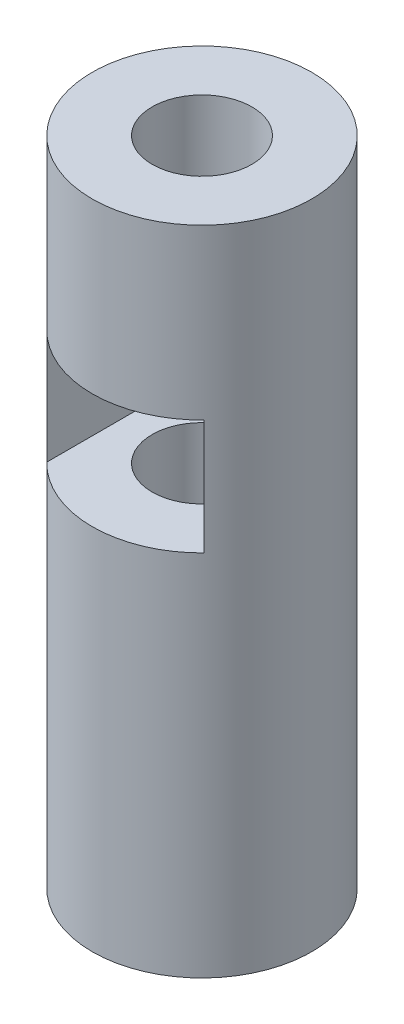
ISO-10303-21;
HEADER;
FILE_DESCRIPTION(('STEP AP214'),'2;1');
FILE_NAME('part.step','',(''),(''),'','','');
FILE_SCHEMA(('AUTOMOTIVE_DESIGN { 1 0 10303 214 1 1 1 1 }'));
ENDSEC;
DATA;
#1=APPLICATION_CONTEXT('core data for automotive mechanical design processes');
#2=APPLICATION_PROTOCOL_DEFINITION('international standard','automotive_design',2000,#1);
#3=PRODUCT_CONTEXT('',#1,'mechanical');
#4=PRODUCT('Part','Part','',(#3));
#5=PRODUCT_RELATED_PRODUCT_CATEGORY('part','',(#4));
#6=PRODUCT_DEFINITION_FORMATION('','',#4);
#7=PRODUCT_DEFINITION_CONTEXT('part definition',#1,'design');
#8=PRODUCT_DEFINITION('design','',#6,#7);
#9=PRODUCT_DEFINITION_SHAPE('','',#8);
#10=(LENGTH_UNIT() NAMED_UNIT(*) SI_UNIT(.MILLI.,.METRE.));
#11=(NAMED_UNIT(*) PLANE_ANGLE_UNIT() SI_UNIT($,.RADIAN.));
#12=(NAMED_UNIT(*) SI_UNIT($,.STERADIAN.) SOLID_ANGLE_UNIT());
#13=UNCERTAINTY_MEASURE_WITH_UNIT(LENGTH_MEASURE(1.E-05),#10,'distance_accuracy_value','');
#14=(GEOMETRIC_REPRESENTATION_CONTEXT(3) GLOBAL_UNCERTAINTY_ASSIGNED_CONTEXT((#13)) GLOBAL_UNIT_ASSIGNED_CONTEXT((#10,
#11,#12)) REPRESENTATION_CONTEXT('',''));
#15=CARTESIAN_POINT('',(0.,0.,0.));
#16=DIRECTION('',(0.,0.,1.));
#17=DIRECTION('',(1.,0.,0.));
#18=AXIS2_PLACEMENT_3D('',#15,#16,#17);
#19=CARTESIAN_POINT('',(0.,40.,0.));
#20=DIRECTION('',(0.,-1.,0.));
#21=DIRECTION('',(0.,0.,-1.));
#22=AXIS2_PLACEMENT_3D('',#19,#20,#21);
#23=CYLINDRICAL_SURFACE('',#22,2.6);
#24=CARTESIAN_POINT('',(0.,7.2,0.));
#25=DIRECTION('',(0.,1.,0.));
#26=DIRECTION('',(0.,0.,1.));
#27=AXIS2_PLACEMENT_3D('',#24,#25,#26);
#28=CIRCLE('',#27,2.6);
#29=CARTESIAN_POINT('',(0.,7.2,2.6));
#30=VERTEX_POINT('',#29);
#31=EDGE_CURVE('E190',#30,#30,#28,.F.);
#32=ORIENTED_EDGE('',*,*,#31,.T.);
#33=EDGE_LOOP('',(#32));
#34=FACE_BOUND('',#33,.T.);
#35=CARTESIAN_POINT('',(0.,19.2,0.));
#36=DIRECTION('',(0.,1.,0.));
#37=DIRECTION('',(0.,0.,1.));
#38=AXIS2_PLACEMENT_3D('',#35,#36,#37);
#39=CIRCLE('',#38,2.6);
#40=CARTESIAN_POINT('',(0.,19.2,2.6));
#41=VERTEX_POINT('',#40);
#42=EDGE_CURVE('E121',#41,#41,#39,.F.);
#43=ORIENTED_EDGE('',*,*,#42,.F.);
#44=EDGE_LOOP('',(#43));
#45=FACE_BOUND('',#44,.T.);
#46=ADVANCED_FACE('F33',(#34,#45),#23,.F.);
#47=CARTESIAN_POINT('',(0.,0.,0.));
#48=DIRECTION('',(0.,-1.,0.));
#49=DIRECTION('',(0.,0.,-1.));
#50=AXIS2_PLACEMENT_3D('',#47,#48,#49);
#51=CIRCLE('',#50,2.6);
#52=CARTESIAN_POINT('',(0.,0.,-2.6));
#53=VERTEX_POINT('',#52);
#54=EDGE_CURVE('E194',#53,#53,#51,.T.);
#55=ORIENTED_EDGE('',*,*,#54,.T.);
#56=EDGE_LOOP('',(#55));
#57=FACE_BOUND('',#56,.T.);
#58=CARTESIAN_POINT('',(0.,2.5,0.));
#59=DIRECTION('',(0.,1.,0.));
#60=DIRECTION('',(0.,0.,1.));
#61=AXIS2_PLACEMENT_3D('',#58,#59,#60);
#62=CIRCLE('',#61,2.6);
#63=CARTESIAN_POINT('',(0.,2.5,2.6));
#64=VERTEX_POINT('',#63);
#65=EDGE_CURVE('E198',#64,#64,#62,.F.);
#66=ORIENTED_EDGE('',*,*,#65,.F.);
#67=EDGE_LOOP('',(#66));
#68=FACE_BOUND('',#67,.T.);
#69=ADVANCED_FACE('F237',(#57,#68),#23,.F.);
#70=CARTESIAN_POINT('',(0.,34.,0.));
#71=DIRECTION('',(0.,1.,0.));
#72=DIRECTION('',(0.,0.,1.));
#73=AXIS2_PLACEMENT_3D('',#70,#71,#72);
#74=PLANE('',#73);
#75=CARTESIAN_POINT('',(0.,34.,0.));
#76=DIRECTION('',(0.,1.,0.));
#77=DIRECTION('',(0.,0.,1.));
#78=AXIS2_PLACEMENT_3D('',#75,#76,#77);
#79=CIRCLE('',#78,2.6);
#80=CARTESIAN_POINT('',(0.,34.,2.6));
#81=VERTEX_POINT('',#80);
#82=EDGE_CURVE('E197',#81,#81,#79,.T.);
#83=ORIENTED_EDGE('',*,*,#82,.F.);
#84=EDGE_LOOP('',(#83));
#85=FACE_BOUND('',#84,.T.);
#86=CARTESIAN_POINT('',(0.,34.,0.));
#87=DIRECTION('',(0.,1.,0.));
#88=DIRECTION('',(0.,0.,1.));
#89=AXIS2_PLACEMENT_3D('',#86,#87,#88);
#90=CIRCLE('',#89,5.725);
#91=CARTESIAN_POINT('',(0.,34.,5.725));
#92=VERTEX_POINT('',#91);
#93=EDGE_CURVE('E202',#92,#92,#90,.T.);
#94=ORIENTED_EDGE('',*,*,#93,.T.);
#95=EDGE_LOOP('',(#94));
#96=FACE_BOUND('',#95,.T.);
#97=ADVANCED_FACE('F244',(#85,#96),#74,.T.);
#98=CARTESIAN_POINT('',(0.,0.,0.));
#99=DIRECTION('',(0.,1.,0.));
#100=DIRECTION('',(0.,0.,1.));
#101=AXIS2_PLACEMENT_3D('',#98,#99,#100);
#102=PLANE('',#101);
#103=ORIENTED_EDGE('',*,*,#54,.F.);
#104=EDGE_LOOP('',(#103));
#105=FACE_BOUND('',#104,.T.);
#106=CARTESIAN_POINT('',(0.,0.,0.));
#107=DIRECTION('',(0.,1.,0.));
#108=DIRECTION('',(0.,0.,1.));
#109=AXIS2_PLACEMENT_3D('',#106,#107,#108);
#110=CIRCLE('',#109,5.725);
#111=CARTESIAN_POINT('',(0.,0.,5.725));
#112=VERTEX_POINT('',#111);
#113=EDGE_CURVE('E201',#112,#112,#110,.T.);
#114=ORIENTED_EDGE('',*,*,#113,.F.);
#115=EDGE_LOOP('',(#114));
#116=FACE_BOUND('',#115,.T.);
#117=ADVANCED_FACE('F259',(#105,#116),#102,.F.);
#118=CARTESIAN_POINT('',(0.,34.,0.));
#119=DIRECTION('',(0.,-1.,0.));
#120=DIRECTION('',(0.,0.,-1.));
#121=AXIS2_PLACEMENT_3D('',#118,#119,#120);
#122=CYLINDRICAL_SURFACE('',#121,5.725);
#123=DIRECTION('',(0.,-1.,0.));
#124=VECTOR('',#123,1.);
#125=CARTESIAN_POINT('',(-4.1,34.,3.99570081462564));
#126=LINE('',#125,#124);
#127=CARTESIAN_POINT('',(-4.1,25.2,3.99570081462564));
#128=VERTEX_POINT('',#127);
#129=CARTESIAN_POINT('',(-4.1,19.2,3.99570081462564));
#130=VERTEX_POINT('',#129);
#131=EDGE_CURVE('E11',#128,#130,#126,.T.);
#132=ORIENTED_EDGE('',*,*,#131,.F.);
#133=CARTESIAN_POINT('',(0.,25.2,0.));
#134=DIRECTION('',(0.,1.,0.));
#135=DIRECTION('',(0.,0.,1.));
#136=AXIS2_PLACEMENT_3D('',#133,#134,#135);
#137=CIRCLE('',#136,5.725);
#138=CARTESIAN_POINT('',(4.1,25.2,3.99570081462564));
#139=VERTEX_POINT('',#138);
#140=EDGE_CURVE('E154',#128,#139,#137,.T.);
#141=ORIENTED_EDGE('',*,*,#140,.T.);
#142=DIRECTION('',(0.,-1.,0.));
#143=VECTOR('',#142,1.);
#144=CARTESIAN_POINT('',(4.1,34.,3.99570081462564));
#145=LINE('',#144,#143);
#146=CARTESIAN_POINT('',(4.1,19.2,3.99570081462564));
#147=VERTEX_POINT('',#146);
#148=EDGE_CURVE('E41',#139,#147,#145,.T.);
#149=ORIENTED_EDGE('',*,*,#148,.T.);
#150=CARTESIAN_POINT('',(0.,19.2,0.));
#151=DIRECTION('',(0.,1.,0.));
#152=DIRECTION('',(0.,0.,1.));
#153=AXIS2_PLACEMENT_3D('',#150,#151,#152);
#154=CIRCLE('',#153,5.725);
#155=EDGE_CURVE('E151',#130,#147,#154,.T.);
#156=ORIENTED_EDGE('',*,*,#155,.F.);
#157=EDGE_LOOP('',(#132,#141,#149,#156));
#158=FACE_BOUND('',#157,.T.);
#159=CARTESIAN_POINT('',(0.,7.2,0.));
#160=DIRECTION('',(0.,1.,0.));
#161=DIRECTION('',(-1.,0.,0.));
#162=AXIS2_PLACEMENT_3D('',#159,#160,#161);
#163=CIRCLE('',#162,5.725);
#164=CARTESIAN_POINT('',(4.1,7.2,-3.99570081462564));
#165=VERTEX_POINT('',#164);
#166=CARTESIAN_POINT('',(-4.1,7.2,-3.99570081462564));
#167=VERTEX_POINT('',#166);
#168=EDGE_CURVE('E159',#165,#167,#163,.T.);
#169=ORIENTED_EDGE('',*,*,#168,.T.);
#170=DIRECTION('',(0.,-1.,0.));
#171=VECTOR('',#170,1.);
#172=CARTESIAN_POINT('',(-4.1,34.,-3.99570081462564));
#173=LINE('',#172,#171);
#174=CARTESIAN_POINT('',(-4.1,2.5,-3.99570081462564));
#175=VERTEX_POINT('',#174);
#176=EDGE_CURVE('E165',#167,#175,#173,.T.);
#177=ORIENTED_EDGE('',*,*,#176,.T.);
#178=CARTESIAN_POINT('',(0.,2.5,0.));
#179=DIRECTION('',(0.,-1.,0.));
#180=DIRECTION('',(1.,0.,0.));
#181=AXIS2_PLACEMENT_3D('',#178,#179,#180);
#182=CIRCLE('',#181,5.725);
#183=CARTESIAN_POINT('',(4.1,2.5,-3.99570081462564));
#184=VERTEX_POINT('',#183);
#185=EDGE_CURVE('E156',#175,#184,#182,.T.);
#186=ORIENTED_EDGE('',*,*,#185,.T.);
#187=DIRECTION('',(0.,-1.,0.));
#188=VECTOR('',#187,1.);
#189=CARTESIAN_POINT('',(4.1,34.,-3.99570081462564));
#190=LINE('',#189,#188);
#191=EDGE_CURVE('E162',#184,#165,#190,.F.);
#192=ORIENTED_EDGE('',*,*,#191,.T.);
#193=EDGE_LOOP('',(#169,#177,#186,#192));
#194=FACE_BOUND('',#193,.T.);
#195=ORIENTED_EDGE('',*,*,#93,.F.);
#196=EDGE_LOOP('',(#195));
#197=FACE_BOUND('',#196,.T.);
#198=ORIENTED_EDGE('',*,*,#113,.T.);
#199=EDGE_LOOP('',(#198));
#200=FACE_BOUND('',#199,.T.);
#201=ADVANCED_FACE('F35',(#158,#194,#197,#200),#122,.T.);
#202=CARTESIAN_POINT('',(0.,25.2,0.));
#203=DIRECTION('',(0.,1.,0.));
#204=DIRECTION('',(0.,0.,1.));
#205=AXIS2_PLACEMENT_3D('',#202,#203,#204);
#206=CIRCLE('',#205,2.6);
#207=CARTESIAN_POINT('',(0.,25.2,2.6));
#208=VERTEX_POINT('',#207);
#209=EDGE_CURVE('E153',#208,#208,#206,.F.);
#210=ORIENTED_EDGE('',*,*,#209,.T.);
#211=EDGE_LOOP('',(#210));
#212=FACE_BOUND('',#211,.T.);
#213=ORIENTED_EDGE('',*,*,#82,.T.);
#214=EDGE_LOOP('',(#213));
#215=FACE_BOUND('',#214,.T.);
#216=ADVANCED_FACE('F240',(#212,#215),#23,.F.);
#217=CARTESIAN_POINT('',(0.,2.5,0.));
#218=DIRECTION('',(0.,1.,0.));
#219=DIRECTION('',(0.,0.,1.));
#220=AXIS2_PLACEMENT_3D('',#217,#218,#219);
#221=PLANE('',#220);
#222=ORIENTED_EDGE('',*,*,#65,.T.);
#223=EDGE_LOOP('',(#222));
#224=FACE_BOUND('',#223,.T.);
#225=DIRECTION('',(0.,0.,1.));
#226=VECTOR('',#225,1.);
#227=CARTESIAN_POINT('',(-4.1,2.5,-2.36713610367747));
#228=LINE('',#227,#226);
#229=CARTESIAN_POINT('',(-4.1,2.5,2.36713610367746));
#230=VERTEX_POINT('',#229);
#231=EDGE_CURVE('E176',#175,#230,#228,.T.);
#232=ORIENTED_EDGE('',*,*,#231,.T.);
#233=DIRECTION('',(0.866025403784439,0.,0.5));
#234=VECTOR('',#233,1.);
#235=CARTESIAN_POINT('',(-4.1,2.5,2.36713610367746));
#236=LINE('',#235,#234);
#237=CARTESIAN_POINT('',(0.,2.5,4.73427220735493));
#238=VERTEX_POINT('',#237);
#239=EDGE_CURVE('E169',#230,#238,#236,.T.);
#240=ORIENTED_EDGE('',*,*,#239,.T.);
#241=DIRECTION('',(0.866025403784439,0.,-0.5));
#242=VECTOR('',#241,1.);
#243=CARTESIAN_POINT('',(0.,2.5,4.73427220735493));
#244=LINE('',#243,#242);
#245=CARTESIAN_POINT('',(4.1,2.5,2.36713610367747));
#246=VERTEX_POINT('',#245);
#247=EDGE_CURVE('E172',#238,#246,#244,.T.);
#248=ORIENTED_EDGE('',*,*,#247,.T.);
#249=DIRECTION('',(0.,0.,-1.));
#250=VECTOR('',#249,1.);
#251=CARTESIAN_POINT('',(4.1,2.5,2.36713610367747));
#252=LINE('',#251,#250);
#253=EDGE_CURVE('E55',#246,#184,#252,.T.);
#254=ORIENTED_EDGE('',*,*,#253,.T.);
#255=ORIENTED_EDGE('',*,*,#185,.F.);
#256=EDGE_LOOP('',(#232,#240,#248,#254,#255));
#257=FACE_BOUND('',#256,.T.);
#258=ADVANCED_FACE('F250',(#224,#257),#221,.T.);
#259=CARTESIAN_POINT('',(0.,7.2,0.));
#260=DIRECTION('',(0.,1.,0.));
#261=DIRECTION('',(0.,0.,1.));
#262=AXIS2_PLACEMENT_3D('',#259,#260,#261);
#263=PLANE('',#262);
#264=ORIENTED_EDGE('',*,*,#31,.F.);
#265=EDGE_LOOP('',(#264));
#266=FACE_BOUND('',#265,.T.);
#267=DIRECTION('',(0.866025403784439,0.,0.5));
#268=VECTOR('',#267,1.);
#269=CARTESIAN_POINT('',(-4.1,7.2,2.36713610367746));
#270=LINE('',#269,#268);
#271=CARTESIAN_POINT('',(-4.1,7.2,2.36713610367746));
#272=VERTEX_POINT('',#271);
#273=CARTESIAN_POINT('',(0.,7.2,4.73427220735493));
#274=VERTEX_POINT('',#273);
#275=EDGE_CURVE('E168',#272,#274,#270,.T.);
#276=ORIENTED_EDGE('',*,*,#275,.F.);
#277=DIRECTION('',(0.,0.,1.));
#278=VECTOR('',#277,1.);
#279=CARTESIAN_POINT('',(-4.1,7.2,-2.36713610367747));
#280=LINE('',#279,#278);
#281=EDGE_CURVE('E173',#167,#272,#280,.T.);
#282=ORIENTED_EDGE('',*,*,#281,.F.);
#283=ORIENTED_EDGE('',*,*,#168,.F.);
#284=DIRECTION('',(0.,0.,-1.));
#285=VECTOR('',#284,1.);
#286=CARTESIAN_POINT('',(4.1,7.2,2.36713610367747));
#287=LINE('',#286,#285);
#288=CARTESIAN_POINT('',(4.1,7.2,2.36713610367747));
#289=VERTEX_POINT('',#288);
#290=EDGE_CURVE('E184',#289,#165,#287,.T.);
#291=ORIENTED_EDGE('',*,*,#290,.F.);
#292=DIRECTION('',(0.866025403784439,0.,-0.5));
#293=VECTOR('',#292,1.);
#294=CARTESIAN_POINT('',(0.,7.2,4.73427220735493));
#295=LINE('',#294,#293);
#296=EDGE_CURVE('E181',#274,#289,#295,.T.);
#297=ORIENTED_EDGE('',*,*,#296,.F.);
#298=EDGE_LOOP('',(#276,#282,#283,#291,#297));
#299=FACE_BOUND('',#298,.T.);
#300=ADVANCED_FACE('F256',(#266,#299),#263,.F.);
#301=CARTESIAN_POINT('',(-4.1,2.5,2.36713610367746));
#302=DIRECTION('',(-0.5,0.,0.866025403784439));
#303=DIRECTION('',(0.866025403784439,0.,0.5));
#304=AXIS2_PLACEMENT_3D('',#301,#302,#303);
#305=PLANE('',#304);
#306=ORIENTED_EDGE('',*,*,#275,.T.);
#307=DIRECTION('',(0.,1.,0.));
#308=VECTOR('',#307,1.);
#309=CARTESIAN_POINT('',(0.,2.5,4.73427220735493));
#310=LINE('',#309,#308);
#311=EDGE_CURVE('E178',#238,#274,#310,.T.);
#312=ORIENTED_EDGE('',*,*,#311,.F.);
#313=ORIENTED_EDGE('',*,*,#239,.F.);
#314=DIRECTION('',(0.,1.,0.));
#315=VECTOR('',#314,1.);
#316=CARTESIAN_POINT('',(-4.1,2.5,2.36713610367746));
#317=LINE('',#316,#315);
#318=EDGE_CURVE('E187',#230,#272,#317,.T.);
#319=ORIENTED_EDGE('',*,*,#318,.T.);
#320=EDGE_LOOP('',(#306,#312,#313,#319));
#321=FACE_BOUND('',#320,.T.);
#322=ADVANCED_FACE('F285',(#321),#305,.F.);
#323=CARTESIAN_POINT('',(-4.1,2.5,-2.36713610367747));
#324=DIRECTION('',(-1.,0.,0.));
#325=DIRECTION('',(0.,0.,1.));
#326=AXIS2_PLACEMENT_3D('',#323,#324,#325);
#327=PLANE('',#326);
#328=ORIENTED_EDGE('',*,*,#318,.F.);
#329=ORIENTED_EDGE('',*,*,#231,.F.);
#330=ORIENTED_EDGE('',*,*,#176,.F.);
#331=ORIENTED_EDGE('',*,*,#281,.T.);
#332=EDGE_LOOP('',(#328,#329,#330,#331));
#333=FACE_BOUND('',#332,.T.);
#334=ADVANCED_FACE('F282',(#333),#327,.F.);
#335=CARTESIAN_POINT('',(4.1,2.5,2.36713610367747));
#336=DIRECTION('',(1.,0.,0.));
#337=DIRECTION('',(0.,0.,-1.));
#338=AXIS2_PLACEMENT_3D('',#335,#336,#337);
#339=PLANE('',#338);
#340=ORIENTED_EDGE('',*,*,#290,.T.);
#341=ORIENTED_EDGE('',*,*,#191,.F.);
#342=ORIENTED_EDGE('',*,*,#253,.F.);
#343=DIRECTION('',(0.,1.,0.));
#344=VECTOR('',#343,1.);
#345=CARTESIAN_POINT('',(4.1,2.5,2.36713610367747));
#346=LINE('',#345,#344);
#347=EDGE_CURVE('E191',#246,#289,#346,.T.);
#348=ORIENTED_EDGE('',*,*,#347,.T.);
#349=EDGE_LOOP('',(#340,#341,#342,#348));
#350=FACE_BOUND('',#349,.T.);
#351=ADVANCED_FACE('F292',(#350),#339,.F.);
#352=CARTESIAN_POINT('',(0.,2.5,4.73427220735493));
#353=DIRECTION('',(0.5,0.,0.866025403784439));
#354=DIRECTION('',(0.866025403784439,0.,-0.5));
#355=AXIS2_PLACEMENT_3D('',#352,#353,#354);
#356=PLANE('',#355);
#357=ORIENTED_EDGE('',*,*,#296,.T.);
#358=ORIENTED_EDGE('',*,*,#347,.F.);
#359=ORIENTED_EDGE('',*,*,#247,.F.);
#360=ORIENTED_EDGE('',*,*,#311,.T.);
#361=EDGE_LOOP('',(#357,#358,#359,#360));
#362=FACE_BOUND('',#361,.T.);
#363=ADVANCED_FACE('F289',(#362),#356,.F.);
#364=CARTESIAN_POINT('',(-4.1,25.2,0.));
#365=DIRECTION('',(1.,0.,0.));
#366=DIRECTION('',(0.,0.,-1.));
#367=AXIS2_PLACEMENT_3D('',#364,#365,#366);
#368=PLANE('',#367);
#369=ORIENTED_EDGE('',*,*,#131,.T.);
#370=DIRECTION('',(0.,0.,1.));
#371=VECTOR('',#370,1.);
#372=CARTESIAN_POINT('',(-4.1,19.2,0.));
#373=LINE('',#372,#371);
#374=CARTESIAN_POINT('',(-4.1,19.2,-2.36713610367747));
#375=VERTEX_POINT('',#374);
#376=EDGE_CURVE('E48',#375,#130,#373,.T.);
#377=ORIENTED_EDGE('',*,*,#376,.F.);
#378=DIRECTION('',(0.,-1.,0.));
#379=VECTOR('',#378,1.);
#380=CARTESIAN_POINT('',(-4.1,25.2,-2.36713610367747));
#381=LINE('',#380,#379);
#382=CARTESIAN_POINT('',(-4.1,25.2,-2.36713610367747));
#383=VERTEX_POINT('',#382);
#384=EDGE_CURVE('E142',#383,#375,#381,.T.);
#385=ORIENTED_EDGE('',*,*,#384,.F.);
#386=DIRECTION('',(0.,0.,1.));
#387=VECTOR('',#386,1.);
#388=CARTESIAN_POINT('',(-4.1,25.2,0.));
#389=LINE('',#388,#387);
#390=EDGE_CURVE('E135',#383,#128,#389,.T.);
#391=ORIENTED_EDGE('',*,*,#390,.T.);
#392=EDGE_LOOP('',(#369,#377,#385,#391));
#393=FACE_BOUND('',#392,.T.);
#394=ADVANCED_FACE('F220',(#393),#368,.T.);
#395=CARTESIAN_POINT('',(4.1,25.2,0.));
#396=DIRECTION('',(1.,0.,0.));
#397=DIRECTION('',(0.,0.,-1.));
#398=AXIS2_PLACEMENT_3D('',#395,#396,#397);
#399=PLANE('',#398);
#400=DIRECTION('',(0.,0.,1.));
#401=VECTOR('',#400,1.);
#402=CARTESIAN_POINT('',(4.1,25.2,0.));
#403=LINE('',#402,#401);
#404=CARTESIAN_POINT('',(4.1,25.2,-2.36713610367747));
#405=VERTEX_POINT('',#404);
#406=EDGE_CURVE('E129',#405,#139,#403,.T.);
#407=ORIENTED_EDGE('',*,*,#406,.F.);
#408=DIRECTION('',(0.,-1.,0.));
#409=VECTOR('',#408,1.);
#410=CARTESIAN_POINT('',(4.1,25.2,-2.36713610367747));
#411=LINE('',#410,#409);
#412=CARTESIAN_POINT('',(4.1,19.2,-2.36713610367747));
#413=VERTEX_POINT('',#412);
#414=EDGE_CURVE('E110',#405,#413,#411,.T.);
#415=ORIENTED_EDGE('',*,*,#414,.T.);
#416=DIRECTION('',(0.,0.,1.));
#417=VECTOR('',#416,1.);
#418=CARTESIAN_POINT('',(4.1,19.2,0.));
#419=LINE('',#418,#417);
#420=EDGE_CURVE('E144',#413,#147,#419,.T.);
#421=ORIENTED_EDGE('',*,*,#420,.T.);
#422=ORIENTED_EDGE('',*,*,#148,.F.);
#423=EDGE_LOOP('',(#407,#415,#421,#422));
#424=FACE_BOUND('',#423,.T.);
#425=ADVANCED_FACE('F133',(#424),#399,.F.);
#426=CARTESIAN_POINT('',(0.,25.2,0.));
#427=DIRECTION('',(0.,1.,0.));
#428=DIRECTION('',(0.,0.,1.));
#429=AXIS2_PLACEMENT_3D('',#426,#427,#428);
#430=PLANE('',#429);
#431=ORIENTED_EDGE('',*,*,#209,.F.);
#432=EDGE_LOOP('',(#431));
#433=FACE_BOUND('',#432,.T.);
#434=ORIENTED_EDGE('',*,*,#390,.F.);
#435=DIRECTION('',(-0.866025403784439,0.,0.5));
#436=VECTOR('',#435,1.);
#437=CARTESIAN_POINT('',(-2.05,25.2,-3.5507041555162));
#438=LINE('',#437,#436);
#439=CARTESIAN_POINT('',(0.,25.2,-4.73427220735493));
#440=VERTEX_POINT('',#439);
#441=EDGE_CURVE('E131',#440,#383,#438,.T.);
#442=ORIENTED_EDGE('',*,*,#441,.F.);
#443=DIRECTION('',(-0.866025403784439,0.,-0.5));
#444=VECTOR('',#443,1.);
#445=CARTESIAN_POINT('',(2.05,25.2,-3.5507041555162));
#446=LINE('',#445,#444);
#447=EDGE_CURVE('E114',#405,#440,#446,.T.);
#448=ORIENTED_EDGE('',*,*,#447,.F.);
#449=ORIENTED_EDGE('',*,*,#406,.T.);
#450=ORIENTED_EDGE('',*,*,#140,.F.);
#451=EDGE_LOOP('',(#434,#442,#448,#449,#450));
#452=FACE_BOUND('',#451,.T.);
#453=ADVANCED_FACE('F128',(#433,#452),#430,.F.);
#454=CARTESIAN_POINT('',(0.,19.2,0.));
#455=DIRECTION('',(0.,1.,0.));
#456=DIRECTION('',(0.,0.,1.));
#457=AXIS2_PLACEMENT_3D('',#454,#455,#456);
#458=PLANE('',#457);
#459=ORIENTED_EDGE('',*,*,#42,.T.);
#460=EDGE_LOOP('',(#459));
#461=FACE_BOUND('',#460,.T.);
#462=ORIENTED_EDGE('',*,*,#155,.T.);
#463=ORIENTED_EDGE('',*,*,#420,.F.);
#464=DIRECTION('',(-0.866025403784439,0.,-0.5));
#465=VECTOR('',#464,1.);
#466=CARTESIAN_POINT('',(2.05,19.2,-3.5507041555162));
#467=LINE('',#466,#465);
#468=CARTESIAN_POINT('',(0.,19.2,-4.73427220735493));
#469=VERTEX_POINT('',#468);
#470=EDGE_CURVE('E116',#413,#469,#467,.T.);
#471=ORIENTED_EDGE('',*,*,#470,.T.);
#472=DIRECTION('',(-0.866025403784439,0.,0.5));
#473=VECTOR('',#472,1.);
#474=CARTESIAN_POINT('',(-2.05,19.2,-3.5507041555162));
#475=LINE('',#474,#473);
#476=EDGE_CURVE('E138',#469,#375,#475,.T.);
#477=ORIENTED_EDGE('',*,*,#476,.T.);
#478=ORIENTED_EDGE('',*,*,#376,.T.);
#479=EDGE_LOOP('',(#462,#463,#471,#477,#478));
#480=FACE_BOUND('',#479,.T.);
#481=ADVANCED_FACE('F224',(#461,#480),#458,.T.);
#482=CARTESIAN_POINT('',(2.05,25.2,-3.5507041555162));
#483=DIRECTION('',(-0.5,0.,0.866025403784439));
#484=DIRECTION('',(0.866025403784439,0.,0.5));
#485=AXIS2_PLACEMENT_3D('',#482,#483,#484);
#486=PLANE('',#485);
#487=ORIENTED_EDGE('',*,*,#470,.F.);
#488=ORIENTED_EDGE('',*,*,#414,.F.);
#489=ORIENTED_EDGE('',*,*,#447,.T.);
#490=DIRECTION('',(0.,-1.,0.));
#491=VECTOR('',#490,1.);
#492=CARTESIAN_POINT('',(0.,25.2,-4.73427220735493));
#493=LINE('',#492,#491);
#494=EDGE_CURVE('E122',#440,#469,#493,.T.);
#495=ORIENTED_EDGE('',*,*,#494,.T.);
#496=EDGE_LOOP('',(#487,#488,#489,#495));
#497=FACE_BOUND('',#496,.T.);
#498=ADVANCED_FACE('F112',(#497),#486,.T.);
#499=CARTESIAN_POINT('',(-2.05,25.2,-3.5507041555162));
#500=DIRECTION('',(0.5,0.,0.866025403784439));
#501=DIRECTION('',(0.866025403784439,0.,-0.5));
#502=AXIS2_PLACEMENT_3D('',#499,#500,#501);
#503=PLANE('',#502);
#504=ORIENTED_EDGE('',*,*,#476,.F.);
#505=ORIENTED_EDGE('',*,*,#494,.F.);
#506=ORIENTED_EDGE('',*,*,#441,.T.);
#507=ORIENTED_EDGE('',*,*,#384,.T.);
#508=EDGE_LOOP('',(#504,#505,#506,#507));
#509=FACE_BOUND('',#508,.T.);
#510=ADVANCED_FACE('F223',(#509),#503,.T.);
#511=CLOSED_SHELL('',(#46,#69,#97,#117,#201,#216,#258,#300,#322,#334,#351,#363,#394,#425,#453,
#481,#498,#510));
#512=MANIFOLD_SOLID_BREP('B2',#511);
#513=ADVANCED_BREP_SHAPE_REPRESENTATION('',(#18,#512),#14);
#514=SHAPE_DEFINITION_REPRESENTATION(#9,#513);
ENDSEC;
END-ISO-10303-21;
